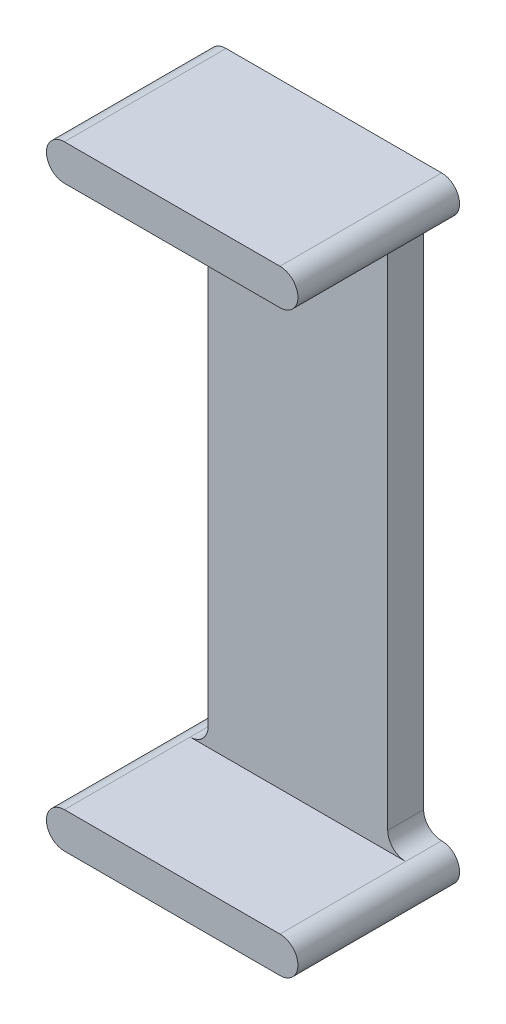
ISO-10303-21;
HEADER;
FILE_DESCRIPTION(('STEP AP214'),'2;1');
FILE_NAME('part.step','',(''),(''),'','','');
FILE_SCHEMA(('AUTOMOTIVE_DESIGN { 1 0 10303 214 1 1 1 1 }'));
ENDSEC;
DATA;
#1=APPLICATION_CONTEXT('core data for automotive mechanical design processes');
#2=APPLICATION_PROTOCOL_DEFINITION('international standard','automotive_design',2000,#1);
#3=PRODUCT_CONTEXT('',#1,'mechanical');
#4=PRODUCT('Part','Part','',(#3));
#5=PRODUCT_RELATED_PRODUCT_CATEGORY('part','',(#4));
#6=PRODUCT_DEFINITION_FORMATION('','',#4);
#7=PRODUCT_DEFINITION_CONTEXT('part definition',#1,'design');
#8=PRODUCT_DEFINITION('design','',#6,#7);
#9=PRODUCT_DEFINITION_SHAPE('','',#8);
#10=(LENGTH_UNIT() NAMED_UNIT(*) SI_UNIT(.MILLI.,.METRE.));
#11=(NAMED_UNIT(*) PLANE_ANGLE_UNIT() SI_UNIT($,.RADIAN.));
#12=(NAMED_UNIT(*) SI_UNIT($,.STERADIAN.) SOLID_ANGLE_UNIT());
#13=UNCERTAINTY_MEASURE_WITH_UNIT(LENGTH_MEASURE(1.E-05),#10,'distance_accuracy_value','');
#14=(GEOMETRIC_REPRESENTATION_CONTEXT(3) GLOBAL_UNCERTAINTY_ASSIGNED_CONTEXT((#13)) GLOBAL_UNIT_ASSIGNED_CONTEXT((#10,
#11,#12)) REPRESENTATION_CONTEXT('',''));
#15=CARTESIAN_POINT('',(0.,0.,0.));
#16=DIRECTION('',(0.,0.,1.));
#17=DIRECTION('',(1.,0.,0.));
#18=AXIS2_PLACEMENT_3D('',#15,#16,#17);
#19=CARTESIAN_POINT('',(-6.,-16.1,2.));
#20=DIRECTION('',(0.,0.,1.));
#21=DIRECTION('',(1.,0.,0.));
#22=AXIS2_PLACEMENT_3D('',#19,#20,#21);
#23=PLANE('',#22);
#24=DIRECTION('',(1.,0.,0.));
#25=VECTOR('',#24,1.);
#26=CARTESIAN_POINT('',(5.,15.1,2.));
#27=LINE('',#26,#25);
#28=CARTESIAN_POINT('',(-6.,15.1,2.));
#29=VERTEX_POINT('',#28);
#30=CARTESIAN_POINT('',(6.,15.1,2.));
#31=VERTEX_POINT('',#30);
#32=EDGE_CURVE('E176',#29,#31,#27,.T.);
#33=ORIENTED_EDGE('',*,*,#32,.F.);
#34=CARTESIAN_POINT('',(-6.,14.1,2.));
#35=DIRECTION('',(0.,0.,1.));
#36=DIRECTION('',(1.,0.,0.));
#37=AXIS2_PLACEMENT_3D('',#34,#35,#36);
#38=CIRCLE('',#37,1.);
#39=CARTESIAN_POINT('',(-4.99999999999997,14.1,2.));
#40=VERTEX_POINT('',#39);
#41=EDGE_CURVE('E236',#29,#40,#38,.F.);
#42=ORIENTED_EDGE('',*,*,#41,.T.);
#43=DIRECTION('',(0.,-1.,0.));
#44=VECTOR('',#43,1.);
#45=CARTESIAN_POINT('',(-5.,0.900000000000001,2.));
#46=LINE('',#45,#44);
#47=CARTESIAN_POINT('',(-5.00000000000002,-14.1,2.));
#48=VERTEX_POINT('',#47);
#49=EDGE_CURVE('E180',#40,#48,#46,.T.);
#50=ORIENTED_EDGE('',*,*,#49,.T.);
#51=CARTESIAN_POINT('',(-6.,-14.1,2.));
#52=DIRECTION('',(0.,0.,1.));
#53=DIRECTION('',(1.,0.,0.));
#54=AXIS2_PLACEMENT_3D('',#51,#52,#53);
#55=CIRCLE('',#54,1.);
#56=CARTESIAN_POINT('',(-6.,-15.1,2.));
#57=VERTEX_POINT('',#56);
#58=EDGE_CURVE('E240',#48,#57,#55,.F.);
#59=ORIENTED_EDGE('',*,*,#58,.T.);
#60=DIRECTION('',(1.,0.,0.));
#61=VECTOR('',#60,1.);
#62=CARTESIAN_POINT('',(-6.,-15.1,2.));
#63=LINE('',#62,#61);
#64=CARTESIAN_POINT('',(6.,-15.1,2.));
#65=VERTEX_POINT('',#64);
#66=EDGE_CURVE('E178',#57,#65,#63,.T.);
#67=ORIENTED_EDGE('',*,*,#66,.T.);
#68=CARTESIAN_POINT('',(6.,-14.1,2.));
#69=DIRECTION('',(0.,0.,1.));
#70=DIRECTION('',(1.,0.,0.));
#71=AXIS2_PLACEMENT_3D('',#68,#69,#70);
#72=CIRCLE('',#71,1.);
#73=CARTESIAN_POINT('',(5.,-14.1,2.));
#74=VERTEX_POINT('',#73);
#75=EDGE_CURVE('E11',#65,#74,#72,.F.);
#76=ORIENTED_EDGE('',*,*,#75,.T.);
#77=DIRECTION('',(0.,1.,0.));
#78=VECTOR('',#77,1.);
#79=CARTESIAN_POINT('',(5.,-1.1,2.));
#80=LINE('',#79,#78);
#81=CARTESIAN_POINT('',(5.,14.1,2.));
#82=VERTEX_POINT('',#81);
#83=EDGE_CURVE('E183',#74,#82,#80,.T.);
#84=ORIENTED_EDGE('',*,*,#83,.T.);
#85=CARTESIAN_POINT('',(6.,14.1,2.));
#86=DIRECTION('',(0.,0.,1.));
#87=DIRECTION('',(1.,0.,0.));
#88=AXIS2_PLACEMENT_3D('',#85,#86,#87);
#89=CIRCLE('',#88,1.);
#90=EDGE_CURVE('E245',#82,#31,#89,.F.);
#91=ORIENTED_EDGE('',*,*,#90,.T.);
#92=EDGE_LOOP('',(#33,#42,#50,#59,#67,#76,#84,#91));
#93=FACE_BOUND('',#92,.T.);
#94=ADVANCED_FACE('F33',(#93),#23,.T.);
#95=CARTESIAN_POINT('',(-6.,-16.1,2.));
#96=DIRECTION('',(0.,0.,-1.));
#97=DIRECTION('',(-1.,0.,0.));
#98=AXIS2_PLACEMENT_3D('',#95,#96,#97);
#99=CYLINDRICAL_SURFACE('',#98,1.);
#100=CARTESIAN_POINT('',(-6.,-16.1,0.));
#101=DIRECTION('',(0.,0.,1.));
#102=DIRECTION('',(1.,0.,0.));
#103=AXIS2_PLACEMENT_3D('',#100,#101,#102);
#104=CIRCLE('',#103,1.);
#105=CARTESIAN_POINT('',(-6.,-15.1,0.));
#106=VERTEX_POINT('',#105);
#107=CARTESIAN_POINT('',(-6.,-17.1,0.));
#108=VERTEX_POINT('',#107);
#109=EDGE_CURVE('E142',#106,#108,#104,.T.);
#110=ORIENTED_EDGE('',*,*,#109,.T.);
#111=DIRECTION('',(0.,0.,-1.));
#112=VECTOR('',#111,1.);
#113=CARTESIAN_POINT('',(-6.,-17.1,2.));
#114=LINE('',#113,#112);
#115=CARTESIAN_POINT('',(-6.,-17.1,9.));
#116=VERTEX_POINT('',#115);
#117=EDGE_CURVE('E134',#116,#108,#114,.T.);
#118=ORIENTED_EDGE('',*,*,#117,.F.);
#119=CARTESIAN_POINT('',(-6.,-16.1,9.));
#120=DIRECTION('',(0.,0.,1.));
#121=DIRECTION('',(-1.,0.,0.));
#122=AXIS2_PLACEMENT_3D('',#119,#120,#121);
#123=CIRCLE('',#122,1.);
#124=CARTESIAN_POINT('',(-6.,-15.1,9.));
#125=VERTEX_POINT('',#124);
#126=EDGE_CURVE('E139',#125,#116,#123,.T.);
#127=ORIENTED_EDGE('',*,*,#126,.F.);
#128=DIRECTION('',(0.,0.,-1.));
#129=VECTOR('',#128,1.);
#130=CARTESIAN_POINT('',(-6.,-15.1,2.));
#131=LINE('',#130,#129);
#132=EDGE_CURVE('E179',#125,#57,#131,.T.);
#133=ORIENTED_EDGE('',*,*,#132,.T.);
#134=EDGE_CURVE('E144',#57,#106,#131,.T.);
#135=ORIENTED_EDGE('',*,*,#134,.T.);
#136=EDGE_LOOP('',(#110,#118,#127,#133,#135));
#137=FACE_BOUND('',#136,.T.);
#138=ADVANCED_FACE('F136',(#137),#99,.T.);
#139=CARTESIAN_POINT('',(6.,-17.1,2.));
#140=DIRECTION('',(0.,1.,0.));
#141=DIRECTION('',(0.,0.,1.));
#142=AXIS2_PLACEMENT_3D('',#139,#140,#141);
#143=PLANE('',#142);
#144=DIRECTION('',(1.,0.,0.));
#145=VECTOR('',#144,1.);
#146=CARTESIAN_POINT('',(6.,-17.1,0.));
#147=LINE('',#146,#145);
#148=CARTESIAN_POINT('',(6.,-17.1,0.));
#149=VERTEX_POINT('',#148);
#150=EDGE_CURVE('E188',#108,#149,#147,.T.);
#151=ORIENTED_EDGE('',*,*,#150,.T.);
#152=DIRECTION('',(0.,0.,-1.));
#153=VECTOR('',#152,1.);
#154=CARTESIAN_POINT('',(6.,-17.1,2.));
#155=LINE('',#154,#153);
#156=CARTESIAN_POINT('',(6.,-17.1,9.));
#157=VERTEX_POINT('',#156);
#158=EDGE_CURVE('E145',#157,#149,#155,.T.);
#159=ORIENTED_EDGE('',*,*,#158,.F.);
#160=DIRECTION('',(1.,0.,0.));
#161=VECTOR('',#160,1.);
#162=CARTESIAN_POINT('',(6.,-17.1,9.));
#163=LINE('',#162,#161);
#164=EDGE_CURVE('E148',#116,#157,#163,.T.);
#165=ORIENTED_EDGE('',*,*,#164,.F.);
#166=ORIENTED_EDGE('',*,*,#117,.T.);
#167=EDGE_LOOP('',(#151,#159,#165,#166));
#168=FACE_BOUND('',#167,.T.);
#169=ADVANCED_FACE('F149',(#168),#143,.F.);
#170=CARTESIAN_POINT('',(6.,-16.1,2.));
#171=DIRECTION('',(0.,0.,-1.));
#172=DIRECTION('',(-1.,0.,0.));
#173=AXIS2_PLACEMENT_3D('',#170,#171,#172);
#174=CYLINDRICAL_SURFACE('',#173,1.);
#175=CARTESIAN_POINT('',(6.,-16.1,0.));
#176=DIRECTION('',(0.,0.,1.));
#177=DIRECTION('',(-1.,0.,0.));
#178=AXIS2_PLACEMENT_3D('',#175,#176,#177);
#179=CIRCLE('',#178,1.);
#180=CARTESIAN_POINT('',(6.,-15.1,0.));
#181=VERTEX_POINT('',#180);
#182=EDGE_CURVE('E190',#149,#181,#179,.T.);
#183=ORIENTED_EDGE('',*,*,#182,.T.);
#184=DIRECTION('',(0.,0.,-1.));
#185=VECTOR('',#184,1.);
#186=CARTESIAN_POINT('',(6.,-15.1,2.));
#187=LINE('',#186,#185);
#188=EDGE_CURVE('E218',#65,#181,#187,.T.);
#189=ORIENTED_EDGE('',*,*,#188,.F.);
#190=CARTESIAN_POINT('',(6.,-15.1,9.));
#191=VERTEX_POINT('',#190);
#192=EDGE_CURVE('E219',#191,#65,#187,.T.);
#193=ORIENTED_EDGE('',*,*,#192,.F.);
#194=CARTESIAN_POINT('',(6.,-16.1,9.));
#195=DIRECTION('',(0.,0.,1.));
#196=DIRECTION('',(-1.,0.,0.));
#197=AXIS2_PLACEMENT_3D('',#194,#195,#196);
#198=CIRCLE('',#197,1.);
#199=EDGE_CURVE('E154',#157,#191,#198,.T.);
#200=ORIENTED_EDGE('',*,*,#199,.F.);
#201=ORIENTED_EDGE('',*,*,#158,.T.);
#202=EDGE_LOOP('',(#183,#189,#193,#200,#201));
#203=FACE_BOUND('',#202,.T.);
#204=ADVANCED_FACE('F256',(#203),#174,.T.);
#205=CARTESIAN_POINT('',(6.,-15.1,2.));
#206=DIRECTION('',(0.,-1.,0.));
#207=DIRECTION('',(0.,0.,-1.));
#208=AXIS2_PLACEMENT_3D('',#205,#206,#207);
#209=PLANE('',#208);
#210=ORIENTED_EDGE('',*,*,#66,.F.);
#211=ORIENTED_EDGE('',*,*,#132,.F.);
#212=DIRECTION('',(-1.,0.,0.));
#213=VECTOR('',#212,1.);
#214=CARTESIAN_POINT('',(5.,-15.1,9.));
#215=LINE('',#214,#213);
#216=EDGE_CURVE('E159',#191,#125,#215,.T.);
#217=ORIENTED_EDGE('',*,*,#216,.F.);
#218=ORIENTED_EDGE('',*,*,#192,.T.);
#219=EDGE_LOOP('',(#210,#211,#217,#218));
#220=FACE_BOUND('',#219,.T.);
#221=ADVANCED_FACE('F295',(#220),#209,.F.);
#222=CARTESIAN_POINT('',(5.,15.1,2.));
#223=DIRECTION('',(-1.,0.,0.));
#224=DIRECTION('',(0.,0.,1.));
#225=AXIS2_PLACEMENT_3D('',#222,#223,#224);
#226=PLANE('',#225);
#227=DIRECTION('',(0.,1.,0.));
#228=VECTOR('',#227,1.);
#229=CARTESIAN_POINT('',(5.,15.1,0.));
#230=LINE('',#229,#228);
#231=CARTESIAN_POINT('',(5.,-14.1,0.));
#232=VERTEX_POINT('',#231);
#233=CARTESIAN_POINT('',(5.,14.1,0.));
#234=VERTEX_POINT('',#233);
#235=EDGE_CURVE('E193',#232,#234,#230,.T.);
#236=ORIENTED_EDGE('',*,*,#235,.T.);
#237=DIRECTION('',(0.,0.,-1.));
#238=VECTOR('',#237,1.);
#239=CARTESIAN_POINT('',(5.,14.1,2.));
#240=LINE('',#239,#238);
#241=EDGE_CURVE('E48',#234,#82,#240,.F.);
#242=ORIENTED_EDGE('',*,*,#241,.T.);
#243=ORIENTED_EDGE('',*,*,#83,.F.);
#244=DIRECTION('',(0.,0.,-1.));
#245=VECTOR('',#244,1.);
#246=CARTESIAN_POINT('',(5.,-14.1,0.));
#247=LINE('',#246,#245);
#248=EDGE_CURVE('E230',#74,#232,#247,.T.);
#249=ORIENTED_EDGE('',*,*,#248,.T.);
#250=EDGE_LOOP('',(#236,#242,#243,#249));
#251=FACE_BOUND('',#250,.T.);
#252=ADVANCED_FACE('F257',(#251),#226,.F.);
#253=CARTESIAN_POINT('',(6.,16.1,2.));
#254=DIRECTION('',(0.,0.,-1.));
#255=DIRECTION('',(-1.,0.,0.));
#256=AXIS2_PLACEMENT_3D('',#253,#254,#255);
#257=CYLINDRICAL_SURFACE('',#256,1.);
#258=CARTESIAN_POINT('',(6.,16.1,0.));
#259=DIRECTION('',(0.,0.,1.));
#260=DIRECTION('',(1.,0.,0.));
#261=AXIS2_PLACEMENT_3D('',#258,#259,#260);
#262=CIRCLE('',#261,1.);
#263=CARTESIAN_POINT('',(6.,15.1,0.));
#264=VERTEX_POINT('',#263);
#265=CARTESIAN_POINT('',(6.,17.1,0.));
#266=VERTEX_POINT('',#265);
#267=EDGE_CURVE('E195',#264,#266,#262,.T.);
#268=ORIENTED_EDGE('',*,*,#267,.T.);
#269=DIRECTION('',(0.,0.,-1.));
#270=VECTOR('',#269,1.);
#271=CARTESIAN_POINT('',(6.,17.1,2.));
#272=LINE('',#271,#270);
#273=CARTESIAN_POINT('',(6.,17.1,9.));
#274=VERTEX_POINT('',#273);
#275=EDGE_CURVE('E211',#274,#266,#272,.T.);
#276=ORIENTED_EDGE('',*,*,#275,.F.);
#277=CARTESIAN_POINT('',(6.,16.1,9.));
#278=DIRECTION('',(0.,0.,1.));
#279=DIRECTION('',(1.,0.,0.));
#280=AXIS2_PLACEMENT_3D('',#277,#278,#279);
#281=CIRCLE('',#280,1.);
#282=CARTESIAN_POINT('',(6.,15.1,9.));
#283=VERTEX_POINT('',#282);
#284=EDGE_CURVE('E170',#283,#274,#281,.T.);
#285=ORIENTED_EDGE('',*,*,#284,.F.);
#286=DIRECTION('',(0.,0.,-1.));
#287=VECTOR('',#286,1.);
#288=CARTESIAN_POINT('',(6.,15.1,2.));
#289=LINE('',#288,#287);
#290=EDGE_CURVE('E215',#283,#31,#289,.T.);
#291=ORIENTED_EDGE('',*,*,#290,.T.);
#292=EDGE_CURVE('E214',#31,#264,#289,.T.);
#293=ORIENTED_EDGE('',*,*,#292,.T.);
#294=EDGE_LOOP('',(#268,#276,#285,#291,#293));
#295=FACE_BOUND('',#294,.T.);
#296=ADVANCED_FACE('F265',(#295),#257,.T.);
#297=CARTESIAN_POINT('',(-6.,17.1,2.));
#298=DIRECTION('',(0.,-1.,0.));
#299=DIRECTION('',(0.,0.,-1.));
#300=AXIS2_PLACEMENT_3D('',#297,#298,#299);
#301=PLANE('',#300);
#302=DIRECTION('',(-1.,0.,0.));
#303=VECTOR('',#302,1.);
#304=CARTESIAN_POINT('',(-6.,17.1,0.));
#305=LINE('',#304,#303);
#306=CARTESIAN_POINT('',(-6.,17.1,0.));
#307=VERTEX_POINT('',#306);
#308=EDGE_CURVE('E198',#266,#307,#305,.T.);
#309=ORIENTED_EDGE('',*,*,#308,.T.);
#310=DIRECTION('',(0.,0.,-1.));
#311=VECTOR('',#310,1.);
#312=CARTESIAN_POINT('',(-6.,17.1,2.));
#313=LINE('',#312,#311);
#314=CARTESIAN_POINT('',(-6.,17.1,9.));
#315=VERTEX_POINT('',#314);
#316=EDGE_CURVE('E208',#315,#307,#313,.T.);
#317=ORIENTED_EDGE('',*,*,#316,.F.);
#318=DIRECTION('',(-1.,0.,0.));
#319=VECTOR('',#318,1.);
#320=CARTESIAN_POINT('',(6.,17.1,9.));
#321=LINE('',#320,#319);
#322=EDGE_CURVE('E173',#274,#315,#321,.T.);
#323=ORIENTED_EDGE('',*,*,#322,.F.);
#324=ORIENTED_EDGE('',*,*,#275,.T.);
#325=EDGE_LOOP('',(#309,#317,#323,#324));
#326=FACE_BOUND('',#325,.T.);
#327=ADVANCED_FACE('F269',(#326),#301,.F.);
#328=CARTESIAN_POINT('',(-6.,16.1,2.));
#329=DIRECTION('',(0.,0.,-1.));
#330=DIRECTION('',(-1.,0.,0.));
#331=AXIS2_PLACEMENT_3D('',#328,#329,#330);
#332=CYLINDRICAL_SURFACE('',#331,1.);
#333=CARTESIAN_POINT('',(-6.,16.1,0.));
#334=DIRECTION('',(0.,0.,1.));
#335=DIRECTION('',(-1.,0.,0.));
#336=AXIS2_PLACEMENT_3D('',#333,#334,#335);
#337=CIRCLE('',#336,1.);
#338=CARTESIAN_POINT('',(-6.,15.1,0.));
#339=VERTEX_POINT('',#338);
#340=EDGE_CURVE('E200',#307,#339,#337,.T.);
#341=ORIENTED_EDGE('',*,*,#340,.T.);
#342=DIRECTION('',(0.,0.,-1.));
#343=VECTOR('',#342,1.);
#344=CARTESIAN_POINT('',(-6.,15.1,2.));
#345=LINE('',#344,#343);
#346=EDGE_CURVE('E186',#29,#339,#345,.T.);
#347=ORIENTED_EDGE('',*,*,#346,.F.);
#348=CARTESIAN_POINT('',(-6.,15.1,9.));
#349=VERTEX_POINT('',#348);
#350=EDGE_CURVE('E205',#349,#29,#345,.T.);
#351=ORIENTED_EDGE('',*,*,#350,.F.);
#352=CARTESIAN_POINT('',(-6.,16.1,9.));
#353=DIRECTION('',(0.,0.,1.));
#354=DIRECTION('',(1.,0.,0.));
#355=AXIS2_PLACEMENT_3D('',#352,#353,#354);
#356=CIRCLE('',#355,1.);
#357=EDGE_CURVE('E164',#315,#349,#356,.T.);
#358=ORIENTED_EDGE('',*,*,#357,.F.);
#359=ORIENTED_EDGE('',*,*,#316,.T.);
#360=EDGE_LOOP('',(#341,#347,#351,#358,#359));
#361=FACE_BOUND('',#360,.T.);
#362=ADVANCED_FACE('F273',(#361),#332,.T.);
#363=CARTESIAN_POINT('',(-6.,15.1,2.));
#364=DIRECTION('',(0.,1.,0.));
#365=DIRECTION('',(0.,0.,1.));
#366=AXIS2_PLACEMENT_3D('',#363,#364,#365);
#367=PLANE('',#366);
#368=ORIENTED_EDGE('',*,*,#350,.T.);
#369=ORIENTED_EDGE('',*,*,#32,.T.);
#370=ORIENTED_EDGE('',*,*,#290,.F.);
#371=DIRECTION('',(1.,0.,0.));
#372=VECTOR('',#371,1.);
#373=CARTESIAN_POINT('',(-6.,15.1,9.));
#374=LINE('',#373,#372);
#375=EDGE_CURVE('E167',#349,#283,#374,.T.);
#376=ORIENTED_EDGE('',*,*,#375,.F.);
#377=EDGE_LOOP('',(#368,#369,#370,#376));
#378=FACE_BOUND('',#377,.T.);
#379=ADVANCED_FACE('F280',(#378),#367,.F.);
#380=CARTESIAN_POINT('',(-5.,15.1,2.));
#381=DIRECTION('',(1.,0.,0.));
#382=DIRECTION('',(0.,0.,-1.));
#383=AXIS2_PLACEMENT_3D('',#380,#381,#382);
#384=PLANE('',#383);
#385=ORIENTED_EDGE('',*,*,#49,.F.);
#386=DIRECTION('',(0.,0.,-1.));
#387=VECTOR('',#386,1.);
#388=CARTESIAN_POINT('',(-5.,14.1,0.));
#389=LINE('',#388,#387);
#390=CARTESIAN_POINT('',(-5.,14.1,0.));
#391=VERTEX_POINT('',#390);
#392=EDGE_CURVE('E227',#40,#391,#389,.T.);
#393=ORIENTED_EDGE('',*,*,#392,.T.);
#394=DIRECTION('',(0.,-1.,0.));
#395=VECTOR('',#394,1.);
#396=CARTESIAN_POINT('',(-5.,15.1,0.));
#397=LINE('',#396,#395);
#398=CARTESIAN_POINT('',(-5.,-14.1,0.));
#399=VERTEX_POINT('',#398);
#400=EDGE_CURVE('E184',#391,#399,#397,.T.);
#401=ORIENTED_EDGE('',*,*,#400,.T.);
#402=DIRECTION('',(0.,0.,-1.));
#403=VECTOR('',#402,1.);
#404=CARTESIAN_POINT('',(-5.,-14.1,2.));
#405=LINE('',#404,#403);
#406=EDGE_CURVE('E225',#399,#48,#405,.F.);
#407=ORIENTED_EDGE('',*,*,#406,.T.);
#408=EDGE_LOOP('',(#385,#393,#401,#407));
#409=FACE_BOUND('',#408,.T.);
#410=ADVANCED_FACE('F288',(#409),#384,.F.);
#411=CARTESIAN_POINT('',(-6.,-16.1,0.));
#412=DIRECTION('',(0.,0.,1.));
#413=DIRECTION('',(1.,0.,0.));
#414=AXIS2_PLACEMENT_3D('',#411,#412,#413);
#415=PLANE('',#414);
#416=ORIENTED_EDGE('',*,*,#109,.F.);
#417=CARTESIAN_POINT('',(-6.,-14.1,0.));
#418=DIRECTION('',(0.,0.,1.));
#419=DIRECTION('',(1.,0.,0.));
#420=AXIS2_PLACEMENT_3D('',#417,#418,#419);
#421=CIRCLE('',#420,1.);
#422=EDGE_CURVE('E238',#106,#399,#421,.T.);
#423=ORIENTED_EDGE('',*,*,#422,.T.);
#424=ORIENTED_EDGE('',*,*,#400,.F.);
#425=CARTESIAN_POINT('',(-6.,14.1,0.));
#426=DIRECTION('',(0.,0.,1.));
#427=DIRECTION('',(1.,0.,0.));
#428=AXIS2_PLACEMENT_3D('',#425,#426,#427);
#429=CIRCLE('',#428,1.);
#430=EDGE_CURVE('E234',#391,#339,#429,.T.);
#431=ORIENTED_EDGE('',*,*,#430,.T.);
#432=ORIENTED_EDGE('',*,*,#340,.F.);
#433=ORIENTED_EDGE('',*,*,#308,.F.);
#434=ORIENTED_EDGE('',*,*,#267,.F.);
#435=CARTESIAN_POINT('',(6.,14.1,0.));
#436=DIRECTION('',(0.,0.,1.));
#437=DIRECTION('',(1.,0.,0.));
#438=AXIS2_PLACEMENT_3D('',#435,#436,#437);
#439=CIRCLE('',#438,1.);
#440=EDGE_CURVE('E243',#264,#234,#439,.T.);
#441=ORIENTED_EDGE('',*,*,#440,.T.);
#442=ORIENTED_EDGE('',*,*,#235,.F.);
#443=CARTESIAN_POINT('',(6.,-14.1,0.));
#444=DIRECTION('',(0.,0.,1.));
#445=DIRECTION('',(1.,0.,0.));
#446=AXIS2_PLACEMENT_3D('',#443,#444,#445);
#447=CIRCLE('',#446,1.);
#448=EDGE_CURVE('E41',#232,#181,#447,.T.);
#449=ORIENTED_EDGE('',*,*,#448,.T.);
#450=ORIENTED_EDGE('',*,*,#182,.F.);
#451=ORIENTED_EDGE('',*,*,#150,.F.);
#452=EDGE_LOOP('',(#416,#423,#424,#431,#432,#433,#434,#441,#442,#449,#450,#451));
#453=FACE_BOUND('',#452,.T.);
#454=ADVANCED_FACE('F250',(#453),#415,.F.);
#455=CARTESIAN_POINT('',(-6.,16.1,9.));
#456=DIRECTION('',(0.,0.,1.));
#457=DIRECTION('',(1.,0.,0.));
#458=AXIS2_PLACEMENT_3D('',#455,#456,#457);
#459=PLANE('',#458);
#460=ORIENTED_EDGE('',*,*,#357,.T.);
#461=ORIENTED_EDGE('',*,*,#375,.T.);
#462=ORIENTED_EDGE('',*,*,#284,.T.);
#463=ORIENTED_EDGE('',*,*,#322,.T.);
#464=EDGE_LOOP('',(#460,#461,#462,#463));
#465=FACE_BOUND('',#464,.T.);
#466=ADVANCED_FACE('F278',(#465),#459,.T.);
#467=CARTESIAN_POINT('',(-6.,-16.1,9.));
#468=DIRECTION('',(0.,0.,-1.));
#469=DIRECTION('',(-1.,0.,0.));
#470=AXIS2_PLACEMENT_3D('',#467,#468,#469);
#471=PLANE('',#470);
#472=ORIENTED_EDGE('',*,*,#126,.T.);
#473=ORIENTED_EDGE('',*,*,#164,.T.);
#474=ORIENTED_EDGE('',*,*,#199,.T.);
#475=ORIENTED_EDGE('',*,*,#216,.T.);
#476=EDGE_LOOP('',(#472,#473,#474,#475));
#477=FACE_BOUND('',#476,.T.);
#478=ADVANCED_FACE('F157',(#477),#471,.F.);
#479=CARTESIAN_POINT('',(-6.,14.1,2.));
#480=DIRECTION('',(0.,0.,1.));
#481=DIRECTION('',(1.,0.,0.));
#482=AXIS2_PLACEMENT_3D('',#479,#480,#481);
#483=CYLINDRICAL_SURFACE('',#482,1.);
#484=ORIENTED_EDGE('',*,*,#41,.F.);
#485=ORIENTED_EDGE('',*,*,#346,.T.);
#486=ORIENTED_EDGE('',*,*,#430,.F.);
#487=ORIENTED_EDGE('',*,*,#392,.F.);
#488=EDGE_LOOP('',(#484,#485,#486,#487));
#489=FACE_BOUND('',#488,.T.);
#490=ADVANCED_FACE('F284',(#489),#483,.F.);
#491=CARTESIAN_POINT('',(-6.,-14.1,2.));
#492=DIRECTION('',(0.,0.,1.));
#493=DIRECTION('',(1.,0.,0.));
#494=AXIS2_PLACEMENT_3D('',#491,#492,#493);
#495=CYLINDRICAL_SURFACE('',#494,1.);
#496=ORIENTED_EDGE('',*,*,#58,.F.);
#497=ORIENTED_EDGE('',*,*,#406,.F.);
#498=ORIENTED_EDGE('',*,*,#422,.F.);
#499=ORIENTED_EDGE('',*,*,#134,.F.);
#500=EDGE_LOOP('',(#496,#497,#498,#499));
#501=FACE_BOUND('',#500,.T.);
#502=ADVANCED_FACE('F293',(#501),#495,.F.);
#503=CARTESIAN_POINT('',(6.,14.1,2.));
#504=DIRECTION('',(0.,0.,1.));
#505=DIRECTION('',(1.,0.,0.));
#506=AXIS2_PLACEMENT_3D('',#503,#504,#505);
#507=CYLINDRICAL_SURFACE('',#506,1.);
#508=ORIENTED_EDGE('',*,*,#90,.F.);
#509=ORIENTED_EDGE('',*,*,#241,.F.);
#510=ORIENTED_EDGE('',*,*,#440,.F.);
#511=ORIENTED_EDGE('',*,*,#292,.F.);
#512=EDGE_LOOP('',(#508,#509,#510,#511));
#513=FACE_BOUND('',#512,.T.);
#514=ADVANCED_FACE('F261',(#513),#507,.F.);
#515=CARTESIAN_POINT('',(6.,-14.1,2.));
#516=DIRECTION('',(0.,0.,1.));
#517=DIRECTION('',(1.,0.,0.));
#518=AXIS2_PLACEMENT_3D('',#515,#516,#517);
#519=CYLINDRICAL_SURFACE('',#518,1.);
#520=ORIENTED_EDGE('',*,*,#75,.F.);
#521=ORIENTED_EDGE('',*,*,#188,.T.);
#522=ORIENTED_EDGE('',*,*,#448,.F.);
#523=ORIENTED_EDGE('',*,*,#248,.F.);
#524=EDGE_LOOP('',(#520,#521,#522,#523));
#525=FACE_BOUND('',#524,.T.);
#526=ADVANCED_FACE('F35',(#525),#519,.F.);
#527=CLOSED_SHELL('',(#94,#138,#169,#204,#221,#252,#296,#327,#362,#379,#410,#454,#466,#478,#490,
#502,#514,#526));
#528=MANIFOLD_SOLID_BREP('B2',#527);
#529=ADVANCED_BREP_SHAPE_REPRESENTATION('',(#18,#528),#14);
#530=SHAPE_DEFINITION_REPRESENTATION(#9,#529);
ENDSEC;
END-ISO-10303-21;
